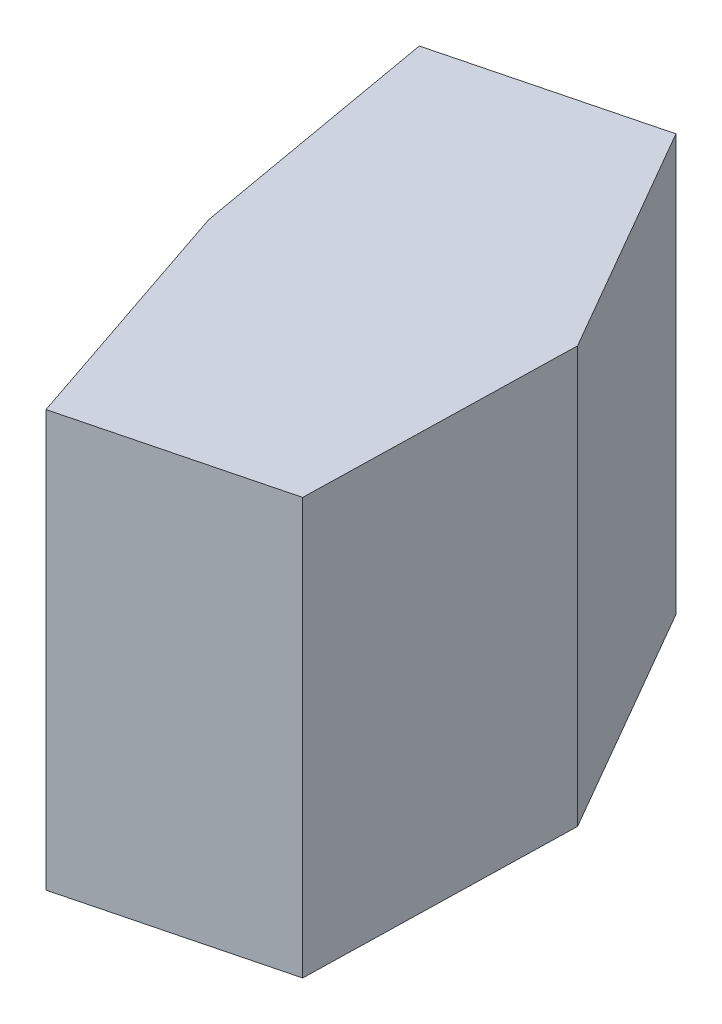
ISO-10303-21;
HEADER;
FILE_DESCRIPTION(('STEP AP214'),'2;1');
FILE_NAME('part.step','',(''),(''),'','','');
FILE_SCHEMA(('AUTOMOTIVE_DESIGN { 1 0 10303 214 1 1 1 1 }'));
ENDSEC;
DATA;
#1=APPLICATION_CONTEXT('core data for automotive mechanical design processes');
#2=APPLICATION_PROTOCOL_DEFINITION('international standard','automotive_design',2000,#1);
#3=PRODUCT_CONTEXT('',#1,'mechanical');
#4=PRODUCT('Part','Part','',(#3));
#5=PRODUCT_RELATED_PRODUCT_CATEGORY('part','',(#4));
#6=PRODUCT_DEFINITION_FORMATION('','',#4);
#7=PRODUCT_DEFINITION_CONTEXT('part definition',#1,'design');
#8=PRODUCT_DEFINITION('design','',#6,#7);
#9=PRODUCT_DEFINITION_SHAPE('','',#8);
#10=(LENGTH_UNIT() NAMED_UNIT(*) SI_UNIT(.MILLI.,.METRE.));
#11=(NAMED_UNIT(*) PLANE_ANGLE_UNIT() SI_UNIT($,.RADIAN.));
#12=(NAMED_UNIT(*) SI_UNIT($,.STERADIAN.) SOLID_ANGLE_UNIT());
#13=UNCERTAINTY_MEASURE_WITH_UNIT(LENGTH_MEASURE(1.E-05),#10,'distance_accuracy_value','');
#14=(GEOMETRIC_REPRESENTATION_CONTEXT(3) GLOBAL_UNCERTAINTY_ASSIGNED_CONTEXT((#13)) GLOBAL_UNIT_ASSIGNED_CONTEXT((#10,
#11,#12)) REPRESENTATION_CONTEXT('',''));
#15=CARTESIAN_POINT('',(0.,0.,0.));
#16=DIRECTION('',(0.,0.,1.));
#17=DIRECTION('',(1.,0.,0.));
#18=AXIS2_PLACEMENT_3D('',#15,#16,#17);
#19=CARTESIAN_POINT('',(4.62915444297856,6.5,26.2532394326674));
#20=DIRECTION('',(0.984807753012209,0.,-0.173648177666925));
#21=DIRECTION('',(-0.173648177666925,0.,-0.984807753012209));
#22=AXIS2_PLACEMENT_3D('',#19,#20,#21);
#23=PLANE('',#22);
#24=DIRECTION('',(0.173648177666925,0.,0.984807753012209));
#25=VECTOR('',#24,1.);
#26=CARTESIAN_POINT('',(4.62915444297856,-6.5,26.2532394326674));
#27=LINE('',#26,#25);
#28=CARTESIAN_POINT('',(3.22143338597694,-6.5,18.2696565950008));
#29=VERTEX_POINT('',#28);
#30=CARTESIAN_POINT('',(4.62915444297856,-6.5,26.2532394326674));
#31=VERTEX_POINT('',#30);
#32=EDGE_CURVE('E134',#29,#31,#27,.T.);
#33=ORIENTED_EDGE('',*,*,#32,.T.);
#34=DIRECTION('',(0.,-1.,0.));
#35=VECTOR('',#34,1.);
#36=CARTESIAN_POINT('',(4.62915444297856,6.5,26.2532394326674));
#37=LINE('',#36,#35);
#38=CARTESIAN_POINT('',(4.62915444297856,6.5,26.2532394326674));
#39=VERTEX_POINT('',#38);
#40=EDGE_CURVE('E131',#39,#31,#37,.T.);
#41=ORIENTED_EDGE('',*,*,#40,.F.);
#42=DIRECTION('',(0.173648177666925,0.,0.984807753012209));
#43=VECTOR('',#42,1.);
#44=CARTESIAN_POINT('',(4.62915444297856,6.5,26.2532394326674));
#45=LINE('',#44,#43);
#46=CARTESIAN_POINT('',(3.22143338597694,6.5,18.2696565950008));
#47=VERTEX_POINT('',#46);
#48=EDGE_CURVE('E79',#47,#39,#45,.T.);
#49=ORIENTED_EDGE('',*,*,#48,.F.);
#50=DIRECTION('',(0.,-1.,0.));
#51=VECTOR('',#50,1.);
#52=CARTESIAN_POINT('',(3.22143338597694,6.5,18.2696565950008));
#53=LINE('',#52,#51);
#54=EDGE_CURVE('E47',#47,#29,#53,.T.);
#55=ORIENTED_EDGE('',*,*,#54,.T.);
#56=EDGE_LOOP('',(#33,#41,#49,#55));
#57=FACE_BOUND('',#56,.T.);
#58=ADVANCED_FACE('F39',(#57),#23,.F.);
#59=CARTESIAN_POINT('',(9.60527189066714,6.5,16.6368189351487));
#60=DIRECTION('',(-0.866025403784439,0.,0.5));
#61=DIRECTION('',(0.5,0.,0.866025403784439));
#62=AXIS2_PLACEMENT_3D('',#59,#60,#61);
#63=PLANE('',#62);
#64=DIRECTION('',(-0.5,0.,-0.866025403784439));
#65=VECTOR('',#64,1.);
#66=CARTESIAN_POINT('',(9.60527189066714,-6.5,16.6368189351487));
#67=LINE('',#66,#65);
#68=CARTESIAN_POINT('',(13.8030904878114,-6.5,23.90765402636));
#69=VERTEX_POINT('',#68);
#70=CARTESIAN_POINT('',(9.60527189066714,-6.5,16.6368189351487));
#71=VERTEX_POINT('',#70);
#72=EDGE_CURVE('E69',#69,#71,#67,.T.);
#73=ORIENTED_EDGE('',*,*,#72,.T.);
#74=DIRECTION('',(0.,-1.,0.));
#75=VECTOR('',#74,1.);
#76=CARTESIAN_POINT('',(9.60527189066714,6.5,16.6368189351487));
#77=LINE('',#76,#75);
#78=CARTESIAN_POINT('',(9.60527189066714,6.5,16.6368189351487));
#79=VERTEX_POINT('',#78);
#80=EDGE_CURVE('E11',#79,#71,#77,.T.);
#81=ORIENTED_EDGE('',*,*,#80,.F.);
#82=DIRECTION('',(-0.5,0.,-0.866025403784439));
#83=VECTOR('',#82,1.);
#84=CARTESIAN_POINT('',(9.60527189066714,6.5,16.6368189351487));
#85=LINE('',#84,#83);
#86=CARTESIAN_POINT('',(13.8030904878114,6.5,23.90765402636));
#87=VERTEX_POINT('',#86);
#88=EDGE_CURVE('E136',#87,#79,#85,.T.);
#89=ORIENTED_EDGE('',*,*,#88,.F.);
#90=DIRECTION('',(0.,-1.,0.));
#91=VECTOR('',#90,1.);
#92=CARTESIAN_POINT('',(13.8030904878114,6.5,23.90765402636));
#93=LINE('',#92,#91);
#94=EDGE_CURVE('E117',#87,#69,#93,.T.);
#95=ORIENTED_EDGE('',*,*,#94,.T.);
#96=EDGE_LOOP('',(#73,#81,#89,#95));
#97=FACE_BOUND('',#96,.T.);
#98=ADVANCED_FACE('F159',(#97),#63,.F.);
#99=CARTESIAN_POINT('',(3.22143338597694,6.5,18.2696565950008));
#100=DIRECTION('',(0.247799448206765,0.,0.968811350815226));
#101=DIRECTION('',(0.968811350815226,0.,-0.247799448206765));
#102=AXIS2_PLACEMENT_3D('',#99,#100,#101);
#103=PLANE('',#102);
#104=DIRECTION('',(-0.968811350815226,0.,0.247799448206765));
#105=VECTOR('',#104,1.);
#106=CARTESIAN_POINT('',(3.22143338597694,-6.5,18.2696565950008));
#107=LINE('',#106,#105);
#108=EDGE_CURVE('E74',#71,#29,#107,.T.);
#109=ORIENTED_EDGE('',*,*,#108,.T.);
#110=ORIENTED_EDGE('',*,*,#54,.F.);
#111=DIRECTION('',(-0.968811350815226,0.,0.247799448206765));
#112=VECTOR('',#111,1.);
#113=CARTESIAN_POINT('',(3.22143338597694,6.5,18.2696565950008));
#114=LINE('',#113,#112);
#115=EDGE_CURVE('E55',#79,#47,#114,.T.);
#116=ORIENTED_EDGE('',*,*,#115,.F.);
#117=ORIENTED_EDGE('',*,*,#80,.T.);
#118=EDGE_LOOP('',(#109,#110,#116,#117));
#119=FACE_BOUND('',#118,.T.);
#120=ADVANCED_FACE('F164',(#119),#103,.F.);
#121=CARTESIAN_POINT('',(0.,6.5,0.));
#122=DIRECTION('',(0.,1.,0.));
#123=DIRECTION('',(0.,0.,1.));
#124=AXIS2_PLACEMENT_3D('',#121,#122,#123);
#125=PLANE('',#124);
#126=ORIENTED_EDGE('',*,*,#48,.T.);
#127=DIRECTION('',(-0.32035143591412,0.,-0.947298768872715));
#128=VECTOR('',#127,1.);
#129=CARTESIAN_POINT('',(4.62915444297856,6.5,26.2532394326674));
#130=LINE('',#129,#128);
#131=CARTESIAN_POINT('',(7.22616103432909,6.5,33.9327465955452));
#132=VERTEX_POINT('',#131);
#133=EDGE_CURVE('E104',#132,#39,#130,.T.);
#134=ORIENTED_EDGE('',*,*,#133,.F.);
#135=DIRECTION('',(-0.968856687433023,0.,0.247622129900194));
#136=VECTOR('',#135,1.);
#137=CARTESIAN_POINT('',(7.22616103432909,6.5,33.9327465955452));
#138=LINE('',#137,#136);
#139=CARTESIAN_POINT('',(13.6102982779287,6.5,32.3010773483382));
#140=VERTEX_POINT('',#139);
#141=EDGE_CURVE('E97',#140,#132,#138,.T.);
#142=ORIENTED_EDGE('',*,*,#141,.F.);
#143=DIRECTION('',(-0.0229633803154118,0.,0.999736306815197));
#144=VECTOR('',#143,1.);
#145=CARTESIAN_POINT('',(13.6102982779287,6.5,32.3010773483382));
#146=LINE('',#145,#144);
#147=EDGE_CURVE('E101',#87,#140,#146,.T.);
#148=ORIENTED_EDGE('',*,*,#147,.F.);
#149=ORIENTED_EDGE('',*,*,#88,.T.);
#150=ORIENTED_EDGE('',*,*,#115,.T.);
#151=EDGE_LOOP('',(#126,#134,#142,#148,#149,#150));
#152=FACE_BOUND('',#151,.T.);
#153=ADVANCED_FACE('F99',(#152),#125,.T.);
#154=CARTESIAN_POINT('',(0.,-6.5,0.));
#155=DIRECTION('',(0.,1.,0.));
#156=DIRECTION('',(0.,0.,1.));
#157=AXIS2_PLACEMENT_3D('',#154,#155,#156);
#158=PLANE('',#157);
#159=ORIENTED_EDGE('',*,*,#32,.F.);
#160=ORIENTED_EDGE('',*,*,#108,.F.);
#161=ORIENTED_EDGE('',*,*,#72,.F.);
#162=DIRECTION('',(-0.0229633803154118,0.,0.999736306815197));
#163=VECTOR('',#162,1.);
#164=CARTESIAN_POINT('',(13.6102982779287,-6.5,32.3010773483382));
#165=LINE('',#164,#163);
#166=CARTESIAN_POINT('',(13.6102982779287,-6.5,32.3010773483382));
#167=VERTEX_POINT('',#166);
#168=EDGE_CURVE('E126',#69,#167,#165,.T.);
#169=ORIENTED_EDGE('',*,*,#168,.T.);
#170=DIRECTION('',(-0.968856687433023,0.,0.247622129900194));
#171=VECTOR('',#170,1.);
#172=CARTESIAN_POINT('',(7.22616103432909,-6.5,33.9327465955452));
#173=LINE('',#172,#171);
#174=CARTESIAN_POINT('',(7.22616103432909,-6.5,33.9327465955452));
#175=VERTEX_POINT('',#174);
#176=EDGE_CURVE('E113',#167,#175,#173,.T.);
#177=ORIENTED_EDGE('',*,*,#176,.T.);
#178=DIRECTION('',(-0.32035143591412,0.,-0.947298768872715));
#179=VECTOR('',#178,1.);
#180=CARTESIAN_POINT('',(4.62915444297856,-6.5,26.2532394326674));
#181=LINE('',#180,#179);
#182=EDGE_CURVE('E123',#175,#31,#181,.T.);
#183=ORIENTED_EDGE('',*,*,#182,.T.);
#184=EDGE_LOOP('',(#159,#160,#161,#169,#177,#183));
#185=FACE_BOUND('',#184,.T.);
#186=ADVANCED_FACE('F144',(#185),#158,.F.);
#187=CARTESIAN_POINT('',(4.62915444297856,6.5,26.2532394326674));
#188=DIRECTION('',(0.947298768872715,0.,-0.32035143591412));
#189=DIRECTION('',(0.32035143591412,0.,0.947298768872715));
#190=AXIS2_PLACEMENT_3D('',#187,#188,#189);
#191=PLANE('',#190);
#192=ORIENTED_EDGE('',*,*,#182,.F.);
#193=DIRECTION('',(0.,-1.,0.));
#194=VECTOR('',#193,1.);
#195=CARTESIAN_POINT('',(7.22616103432909,6.5,33.9327465955452));
#196=LINE('',#195,#194);
#197=EDGE_CURVE('E108',#132,#175,#196,.T.);
#198=ORIENTED_EDGE('',*,*,#197,.F.);
#199=ORIENTED_EDGE('',*,*,#133,.T.);
#200=ORIENTED_EDGE('',*,*,#40,.T.);
#201=EDGE_LOOP('',(#192,#198,#199,#200));
#202=FACE_BOUND('',#201,.T.);
#203=ADVANCED_FACE('F147',(#202),#191,.F.);
#204=CARTESIAN_POINT('',(13.6102982779287,6.5,32.3010773483382));
#205=DIRECTION('',(-0.999736306815197,0.,-0.0229633803154117));
#206=DIRECTION('',(0.0229633803154118,0.,-0.999736306815197));
#207=AXIS2_PLACEMENT_3D('',#204,#205,#206);
#208=PLANE('',#207);
#209=ORIENTED_EDGE('',*,*,#168,.F.);
#210=ORIENTED_EDGE('',*,*,#94,.F.);
#211=ORIENTED_EDGE('',*,*,#147,.T.);
#212=DIRECTION('',(0.,-1.,0.));
#213=VECTOR('',#212,1.);
#214=CARTESIAN_POINT('',(13.6102982779287,6.5,32.3010773483382));
#215=LINE('',#214,#213);
#216=EDGE_CURVE('E111',#140,#167,#215,.T.);
#217=ORIENTED_EDGE('',*,*,#216,.T.);
#218=EDGE_LOOP('',(#209,#210,#211,#217));
#219=FACE_BOUND('',#218,.T.);
#220=ADVANCED_FACE('F119',(#219),#208,.F.);
#221=CARTESIAN_POINT('',(7.22616103432909,6.5,33.9327465955452));
#222=DIRECTION('',(-0.247622129900194,0.,-0.968856687433024));
#223=DIRECTION('',(0.968856687433024,0.,-0.247622129900194));
#224=AXIS2_PLACEMENT_3D('',#221,#222,#223);
#225=PLANE('',#224);
#226=ORIENTED_EDGE('',*,*,#176,.F.);
#227=ORIENTED_EDGE('',*,*,#216,.F.);
#228=ORIENTED_EDGE('',*,*,#141,.T.);
#229=ORIENTED_EDGE('',*,*,#197,.T.);
#230=EDGE_LOOP('',(#226,#227,#228,#229));
#231=FACE_BOUND('',#230,.T.);
#232=ADVANCED_FACE('F112',(#231),#225,.F.);
#233=CLOSED_SHELL('',(#58,#98,#120,#153,#186,#203,#220,#232));
#234=MANIFOLD_SOLID_BREP('B2',#233);
#235=ADVANCED_BREP_SHAPE_REPRESENTATION('',(#18,#234),#14);
#236=SHAPE_DEFINITION_REPRESENTATION(#9,#235);
ENDSEC;
END-ISO-10303-21;
